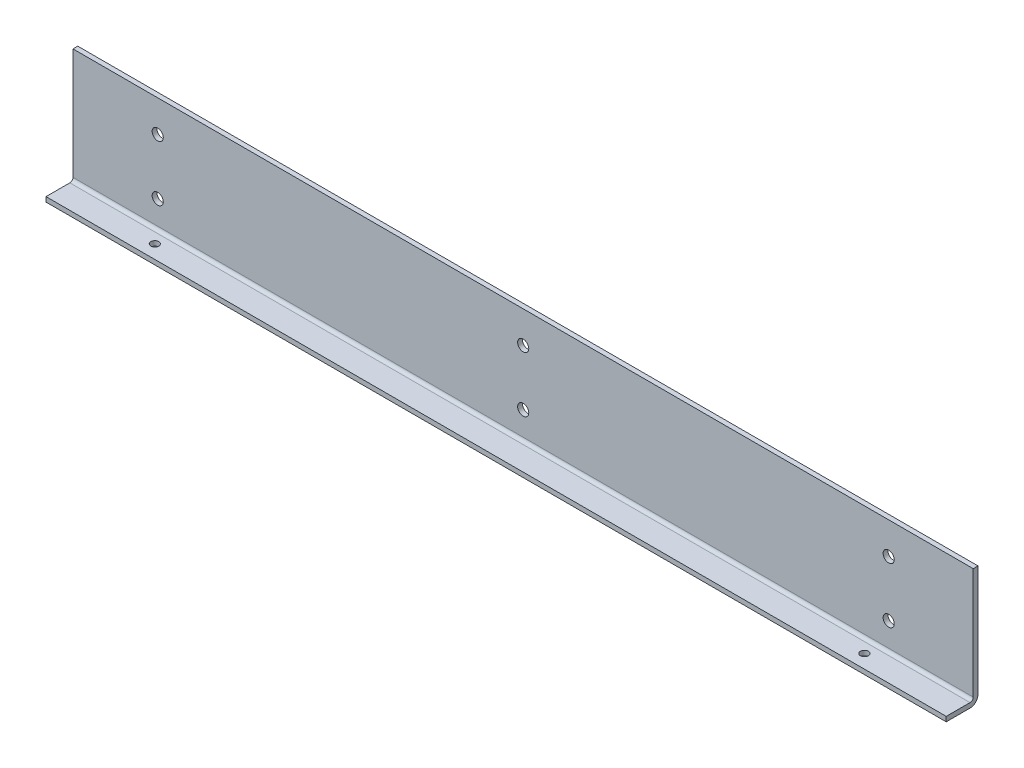
ISO-10303-21;
HEADER;
FILE_DESCRIPTION(('STEP AP214'),'2;1');
FILE_NAME('part.step','',(''),(''),'','','');
FILE_SCHEMA(('AUTOMOTIVE_DESIGN { 1 0 10303 214 1 1 1 1 }'));
ENDSEC;
DATA;
#1=APPLICATION_CONTEXT('core data for automotive mechanical design processes');
#2=APPLICATION_PROTOCOL_DEFINITION('international standard','automotive_design',2000,#1);
#3=PRODUCT_CONTEXT('',#1,'mechanical');
#4=PRODUCT('Part','Part','',(#3));
#5=PRODUCT_RELATED_PRODUCT_CATEGORY('part','',(#4));
#6=PRODUCT_DEFINITION_FORMATION('','',#4);
#7=PRODUCT_DEFINITION_CONTEXT('part definition',#1,'design');
#8=PRODUCT_DEFINITION('design','',#6,#7);
#9=PRODUCT_DEFINITION_SHAPE('','',#8);
#10=(LENGTH_UNIT() NAMED_UNIT(*) SI_UNIT(.MILLI.,.METRE.));
#11=(NAMED_UNIT(*) PLANE_ANGLE_UNIT() SI_UNIT($,.RADIAN.));
#12=(NAMED_UNIT(*) SI_UNIT($,.STERADIAN.) SOLID_ANGLE_UNIT());
#13=UNCERTAINTY_MEASURE_WITH_UNIT(LENGTH_MEASURE(1.E-05),#10,'distance_accuracy_value','');
#14=(GEOMETRIC_REPRESENTATION_CONTEXT(3) GLOBAL_UNCERTAINTY_ASSIGNED_CONTEXT((#13)) GLOBAL_UNIT_ASSIGNED_CONTEXT((#10,
#11,#12)) REPRESENTATION_CONTEXT('',''));
#15=CARTESIAN_POINT('',(0.,0.,0.));
#16=DIRECTION('',(0.,0.,1.));
#17=DIRECTION('',(1.,0.,0.));
#18=AXIS2_PLACEMENT_3D('',#15,#16,#17);
#19=CARTESIAN_POINT('',(0.,0.,3.));
#20=DIRECTION('',(0.,0.,-1.));
#21=DIRECTION('',(-1.,0.,0.));
#22=AXIS2_PLACEMENT_3D('',#19,#20,#21);
#23=PLANE('',#22);
#24=CARTESIAN_POINT('',(513.3,55.,3.));
#25=DIRECTION('',(0.,0.,1.));
#26=DIRECTION('',(1.,0.,0.));
#27=AXIS2_PLACEMENT_3D('',#24,#25,#26);
#28=CIRCLE('',#27,3.49999999999996);
#29=CARTESIAN_POINT('',(516.8,55.,3.));
#30=VERTEX_POINT('',#29);
#31=EDGE_CURVE('E251',#30,#30,#28,.T.);
#32=ORIENTED_EDGE('',*,*,#31,.F.);
#33=EDGE_LOOP('',(#32));
#34=FACE_BOUND('',#33,.T.);
#35=CARTESIAN_POINT('',(283.3,20.,3.));
#36=DIRECTION('',(0.,0.,1.));
#37=DIRECTION('',(1.,0.,0.));
#38=AXIS2_PLACEMENT_3D('',#35,#36,#37);
#39=CIRCLE('',#38,3.50000000000002);
#40=CARTESIAN_POINT('',(286.8,20.,3.));
#41=VERTEX_POINT('',#40);
#42=EDGE_CURVE('E244',#41,#41,#39,.T.);
#43=ORIENTED_EDGE('',*,*,#42,.F.);
#44=EDGE_LOOP('',(#43));
#45=FACE_BOUND('',#44,.T.);
#46=CARTESIAN_POINT('',(283.3,55.,3.));
#47=DIRECTION('',(0.,0.,1.));
#48=DIRECTION('',(1.,0.,0.));
#49=AXIS2_PLACEMENT_3D('',#46,#47,#48);
#50=CIRCLE('',#49,3.50000000000002);
#51=CARTESIAN_POINT('',(286.8,55.,3.));
#52=VERTEX_POINT('',#51);
#53=EDGE_CURVE('E262',#52,#52,#50,.T.);
#54=ORIENTED_EDGE('',*,*,#53,.F.);
#55=EDGE_LOOP('',(#54));
#56=FACE_BOUND('',#55,.T.);
#57=CARTESIAN_POINT('',(53.3,20.,3.));
#58=DIRECTION('',(0.,0.,1.));
#59=DIRECTION('',(1.,0.,0.));
#60=AXIS2_PLACEMENT_3D('',#57,#58,#59);
#61=CIRCLE('',#60,3.5);
#62=CARTESIAN_POINT('',(56.8,20.,3.));
#63=VERTEX_POINT('',#62);
#64=EDGE_CURVE('E256',#63,#63,#61,.T.);
#65=ORIENTED_EDGE('',*,*,#64,.F.);
#66=EDGE_LOOP('',(#65));
#67=FACE_BOUND('',#66,.T.);
#68=CARTESIAN_POINT('',(513.3,20.,3.));
#69=DIRECTION('',(0.,0.,1.));
#70=DIRECTION('',(1.,0.,0.));
#71=AXIS2_PLACEMENT_3D('',#68,#69,#70);
#72=CIRCLE('',#71,3.49999999999996);
#73=CARTESIAN_POINT('',(516.8,20.,3.));
#74=VERTEX_POINT('',#73);
#75=EDGE_CURVE('E237',#74,#74,#72,.T.);
#76=ORIENTED_EDGE('',*,*,#75,.F.);
#77=EDGE_LOOP('',(#76));
#78=FACE_BOUND('',#77,.T.);
#79=CARTESIAN_POINT('',(53.3,55.,3.));
#80=DIRECTION('',(0.,0.,1.));
#81=DIRECTION('',(1.,0.,0.));
#82=AXIS2_PLACEMENT_3D('',#79,#80,#81);
#83=CIRCLE('',#82,3.5);
#84=CARTESIAN_POINT('',(56.8,55.,3.));
#85=VERTEX_POINT('',#84);
#86=EDGE_CURVE('E130',#85,#85,#83,.T.);
#87=ORIENTED_EDGE('',*,*,#86,.F.);
#88=EDGE_LOOP('',(#87));
#89=FACE_BOUND('',#88,.T.);
#90=DIRECTION('',(0.,-1.,0.));
#91=VECTOR('',#90,1.);
#92=CARTESIAN_POINT('',(0.,0.,3.));
#93=LINE('',#92,#91);
#94=CARTESIAN_POINT('',(0.,75.,3.));
#95=VERTEX_POINT('',#94);
#96=CARTESIAN_POINT('',(0.,5.,3.));
#97=VERTEX_POINT('',#96);
#98=EDGE_CURVE('E142',#95,#97,#93,.T.);
#99=ORIENTED_EDGE('',*,*,#98,.T.);
#100=DIRECTION('',(-1.,0.,0.));
#101=VECTOR('',#100,1.);
#102=CARTESIAN_POINT('',(566.5,5.,3.));
#103=LINE('',#102,#101);
#104=CARTESIAN_POINT('',(566.5,5.,3.));
#105=VERTEX_POINT('',#104);
#106=EDGE_CURVE('E163',#97,#105,#103,.F.);
#107=ORIENTED_EDGE('',*,*,#106,.T.);
#108=DIRECTION('',(0.,1.,0.));
#109=VECTOR('',#108,1.);
#110=CARTESIAN_POINT('',(566.5,0.,3.));
#111=LINE('',#110,#109);
#112=CARTESIAN_POINT('',(566.5,75.,3.));
#113=VERTEX_POINT('',#112);
#114=EDGE_CURVE('E145',#105,#113,#111,.T.);
#115=ORIENTED_EDGE('',*,*,#114,.T.);
#116=DIRECTION('',(-1.,0.,0.));
#117=VECTOR('',#116,1.);
#118=CARTESIAN_POINT('',(0.,75.,3.));
#119=LINE('',#118,#117);
#120=EDGE_CURVE('E148',#113,#95,#119,.T.);
#121=ORIENTED_EDGE('',*,*,#120,.T.);
#122=EDGE_LOOP('',(#99,#107,#115,#121));
#123=FACE_BOUND('',#122,.T.);
#124=ADVANCED_FACE('F39',(#34,#45,#56,#67,#78,#89,#123),#23,.F.);
#125=CARTESIAN_POINT('',(0.,0.,3.));
#126=DIRECTION('',(1.,0.,0.));
#127=DIRECTION('',(0.,0.,-1.));
#128=AXIS2_PLACEMENT_3D('',#125,#126,#127);
#129=PLANE('',#128);
#130=DIRECTION('',(0.,-1.,0.));
#131=VECTOR('',#130,1.);
#132=CARTESIAN_POINT('',(0.,0.,0.));
#133=LINE('',#132,#131);
#134=CARTESIAN_POINT('',(0.,75.,0.));
#135=VERTEX_POINT('',#134);
#136=CARTESIAN_POINT('',(0.,5.,0.));
#137=VERTEX_POINT('',#136);
#138=EDGE_CURVE('E141',#135,#137,#133,.T.);
#139=ORIENTED_EDGE('',*,*,#138,.T.);
#140=CARTESIAN_POINT('',(0.,5.,5.));
#141=DIRECTION('',(1.,0.,0.));
#142=DIRECTION('',(0.,0.,-1.));
#143=AXIS2_PLACEMENT_3D('',#140,#141,#142);
#144=CIRCLE('',#143,5.);
#145=CARTESIAN_POINT('',(0.,0.,5.));
#146=VERTEX_POINT('',#145);
#147=EDGE_CURVE('E11',#137,#146,#144,.F.);
#148=ORIENTED_EDGE('',*,*,#147,.T.);
#149=DIRECTION('',(0.,0.,-1.));
#150=VECTOR('',#149,1.);
#151=CARTESIAN_POINT('',(0.,0.,3.));
#152=LINE('',#151,#150);
#153=CARTESIAN_POINT('',(0.,0.,20.));
#154=VERTEX_POINT('',#153);
#155=EDGE_CURVE('E103',#154,#146,#152,.T.);
#156=ORIENTED_EDGE('',*,*,#155,.F.);
#157=DIRECTION('',(0.,-1.,0.));
#158=VECTOR('',#157,1.);
#159=CARTESIAN_POINT('',(0.,0.,20.));
#160=LINE('',#159,#158);
#161=CARTESIAN_POINT('',(0.,3.,20.));
#162=VERTEX_POINT('',#161);
#163=EDGE_CURVE('E108',#162,#154,#160,.T.);
#164=ORIENTED_EDGE('',*,*,#163,.F.);
#165=DIRECTION('',(0.,0.,-1.));
#166=VECTOR('',#165,1.);
#167=CARTESIAN_POINT('',(0.,3.,20.));
#168=LINE('',#167,#166);
#169=CARTESIAN_POINT('',(0.,3.,5.));
#170=VERTEX_POINT('',#169);
#171=EDGE_CURVE('E136',#162,#170,#168,.T.);
#172=ORIENTED_EDGE('',*,*,#171,.T.);
#173=CARTESIAN_POINT('',(0.,5.,5.));
#174=DIRECTION('',(1.,0.,0.));
#175=DIRECTION('',(0.,0.,-1.));
#176=AXIS2_PLACEMENT_3D('',#173,#174,#175);
#177=CIRCLE('',#176,2.);
#178=EDGE_CURVE('E165',#170,#97,#177,.T.);
#179=ORIENTED_EDGE('',*,*,#178,.T.);
#180=ORIENTED_EDGE('',*,*,#98,.F.);
#181=DIRECTION('',(0.,0.,-1.));
#182=VECTOR('',#181,1.);
#183=CARTESIAN_POINT('',(0.,75.,3.));
#184=LINE('',#183,#182);
#185=EDGE_CURVE('E150',#95,#135,#184,.T.);
#186=ORIENTED_EDGE('',*,*,#185,.T.);
#187=EDGE_LOOP('',(#139,#148,#156,#164,#172,#179,#180,#186));
#188=FACE_BOUND('',#187,.T.);
#189=ADVANCED_FACE('F105',(#188),#129,.F.);
#190=CARTESIAN_POINT('',(0.,0.,3.));
#191=DIRECTION('',(0.,1.,0.));
#192=DIRECTION('',(0.,0.,1.));
#193=AXIS2_PLACEMENT_3D('',#190,#191,#192);
#194=PLANE('',#193);
#195=CARTESIAN_POINT('',(60.,0.,11.5));
#196=DIRECTION('',(0.,1.,0.));
#197=DIRECTION('',(0.,0.,1.));
#198=AXIS2_PLACEMENT_3D('',#195,#196,#197);
#199=CIRCLE('',#198,2.49999999999999);
#200=CARTESIAN_POINT('',(60.,0.,14.));
#201=VERTEX_POINT('',#200);
#202=EDGE_CURVE('E225',#201,#201,#199,.T.);
#203=ORIENTED_EDGE('',*,*,#202,.T.);
#204=EDGE_LOOP('',(#203));
#205=FACE_BOUND('',#204,.T.);
#206=CARTESIAN_POINT('',(506.5,0.,11.5));
#207=DIRECTION('',(0.,1.,0.));
#208=DIRECTION('',(0.,0.,1.));
#209=AXIS2_PLACEMENT_3D('',#206,#207,#208);
#210=CIRCLE('',#209,2.50000000000003);
#211=CARTESIAN_POINT('',(506.5,0.,14.));
#212=VERTEX_POINT('',#211);
#213=EDGE_CURVE('E228',#212,#212,#210,.T.);
#214=ORIENTED_EDGE('',*,*,#213,.T.);
#215=EDGE_LOOP('',(#214));
#216=FACE_BOUND('',#215,.T.);
#217=ORIENTED_EDGE('',*,*,#155,.T.);
#218=DIRECTION('',(1.,0.,0.));
#219=VECTOR('',#218,1.);
#220=CARTESIAN_POINT('',(566.5,0.,5.));
#221=LINE('',#220,#219);
#222=CARTESIAN_POINT('',(566.5,0.,5.));
#223=VERTEX_POINT('',#222);
#224=EDGE_CURVE('E169',#146,#223,#221,.T.);
#225=ORIENTED_EDGE('',*,*,#224,.T.);
#226=DIRECTION('',(0.,0.,-1.));
#227=VECTOR('',#226,1.);
#228=CARTESIAN_POINT('',(566.5,0.,3.));
#229=LINE('',#228,#227);
#230=CARTESIAN_POINT('',(566.5,0.,20.));
#231=VERTEX_POINT('',#230);
#232=EDGE_CURVE('E114',#231,#223,#229,.T.);
#233=ORIENTED_EDGE('',*,*,#232,.F.);
#234=DIRECTION('',(1.,0.,0.));
#235=VECTOR('',#234,1.);
#236=CARTESIAN_POINT('',(0.,0.,20.));
#237=LINE('',#236,#235);
#238=EDGE_CURVE('E117',#154,#231,#237,.T.);
#239=ORIENTED_EDGE('',*,*,#238,.F.);
#240=EDGE_LOOP('',(#217,#225,#233,#239));
#241=FACE_BOUND('',#240,.T.);
#242=ADVANCED_FACE('F118',(#205,#216,#241),#194,.F.);
#243=CARTESIAN_POINT('',(566.5,0.,3.));
#244=DIRECTION('',(-1.,0.,0.));
#245=DIRECTION('',(0.,0.,1.));
#246=AXIS2_PLACEMENT_3D('',#243,#244,#245);
#247=PLANE('',#246);
#248=ORIENTED_EDGE('',*,*,#232,.T.);
#249=CARTESIAN_POINT('',(566.5,5.,5.));
#250=DIRECTION('',(-1.,0.,0.));
#251=DIRECTION('',(0.,0.,1.));
#252=AXIS2_PLACEMENT_3D('',#249,#250,#251);
#253=CIRCLE('',#252,5.);
#254=CARTESIAN_POINT('',(566.5,5.,0.));
#255=VERTEX_POINT('',#254);
#256=EDGE_CURVE('E61',#223,#255,#253,.F.);
#257=ORIENTED_EDGE('',*,*,#256,.T.);
#258=DIRECTION('',(0.,1.,0.));
#259=VECTOR('',#258,1.);
#260=CARTESIAN_POINT('',(566.5,0.,0.));
#261=LINE('',#260,#259);
#262=CARTESIAN_POINT('',(566.5,75.,0.));
#263=VERTEX_POINT('',#262);
#264=EDGE_CURVE('E152',#255,#263,#261,.T.);
#265=ORIENTED_EDGE('',*,*,#264,.T.);
#266=DIRECTION('',(0.,0.,-1.));
#267=VECTOR('',#266,1.);
#268=CARTESIAN_POINT('',(566.5,75.,3.));
#269=LINE('',#268,#267);
#270=EDGE_CURVE('E157',#113,#263,#269,.T.);
#271=ORIENTED_EDGE('',*,*,#270,.F.);
#272=ORIENTED_EDGE('',*,*,#114,.F.);
#273=CARTESIAN_POINT('',(566.5,5.,5.));
#274=DIRECTION('',(-1.,0.,0.));
#275=DIRECTION('',(0.,0.,1.));
#276=AXIS2_PLACEMENT_3D('',#273,#274,#275);
#277=CIRCLE('',#276,2.);
#278=CARTESIAN_POINT('',(566.5,3.,5.));
#279=VERTEX_POINT('',#278);
#280=EDGE_CURVE('E167',#105,#279,#277,.T.);
#281=ORIENTED_EDGE('',*,*,#280,.T.);
#282=DIRECTION('',(0.,0.,-1.));
#283=VECTOR('',#282,1.);
#284=CARTESIAN_POINT('',(566.5,3.,20.));
#285=LINE('',#284,#283);
#286=CARTESIAN_POINT('',(566.5,3.,20.));
#287=VERTEX_POINT('',#286);
#288=EDGE_CURVE('E138',#287,#279,#285,.T.);
#289=ORIENTED_EDGE('',*,*,#288,.F.);
#290=DIRECTION('',(0.,1.,0.));
#291=VECTOR('',#290,1.);
#292=CARTESIAN_POINT('',(566.5,0.,20.));
#293=LINE('',#292,#291);
#294=EDGE_CURVE('E121',#231,#287,#293,.T.);
#295=ORIENTED_EDGE('',*,*,#294,.F.);
#296=EDGE_LOOP('',(#248,#257,#265,#271,#272,#281,#289,#295));
#297=FACE_BOUND('',#296,.T.);
#298=ADVANCED_FACE('F172',(#297),#247,.F.);
#299=CARTESIAN_POINT('',(0.,75.,3.));
#300=DIRECTION('',(0.,-1.,0.));
#301=DIRECTION('',(0.,0.,-1.));
#302=AXIS2_PLACEMENT_3D('',#299,#300,#301);
#303=PLANE('',#302);
#304=DIRECTION('',(-1.,0.,0.));
#305=VECTOR('',#304,1.);
#306=CARTESIAN_POINT('',(0.,75.,0.));
#307=LINE('',#306,#305);
#308=EDGE_CURVE('E146',#263,#135,#307,.T.);
#309=ORIENTED_EDGE('',*,*,#308,.T.);
#310=ORIENTED_EDGE('',*,*,#185,.F.);
#311=ORIENTED_EDGE('',*,*,#120,.F.);
#312=ORIENTED_EDGE('',*,*,#270,.T.);
#313=EDGE_LOOP('',(#309,#310,#311,#312));
#314=FACE_BOUND('',#313,.T.);
#315=ADVANCED_FACE('F211',(#314),#303,.F.);
#316=CARTESIAN_POINT('',(0.,0.,0.));
#317=DIRECTION('',(0.,0.,-1.));
#318=DIRECTION('',(-1.,0.,0.));
#319=AXIS2_PLACEMENT_3D('',#316,#317,#318);
#320=PLANE('',#319);
#321=CARTESIAN_POINT('',(513.3,55.,0.));
#322=DIRECTION('',(0.,0.,1.));
#323=DIRECTION('',(1.,0.,0.));
#324=AXIS2_PLACEMENT_3D('',#321,#322,#323);
#325=CIRCLE('',#324,3.49999999999996);
#326=CARTESIAN_POINT('',(516.8,55.,0.));
#327=VERTEX_POINT('',#326);
#328=EDGE_CURVE('E240',#327,#327,#325,.T.);
#329=ORIENTED_EDGE('',*,*,#328,.T.);
#330=EDGE_LOOP('',(#329));
#331=FACE_BOUND('',#330,.T.);
#332=CARTESIAN_POINT('',(283.3,20.,0.));
#333=DIRECTION('',(0.,0.,1.));
#334=DIRECTION('',(1.,0.,0.));
#335=AXIS2_PLACEMENT_3D('',#332,#333,#334);
#336=CIRCLE('',#335,3.50000000000002);
#337=CARTESIAN_POINT('',(286.8,20.,0.));
#338=VERTEX_POINT('',#337);
#339=EDGE_CURVE('E248',#338,#338,#336,.T.);
#340=ORIENTED_EDGE('',*,*,#339,.T.);
#341=EDGE_LOOP('',(#340));
#342=FACE_BOUND('',#341,.T.);
#343=CARTESIAN_POINT('',(283.3,55.,0.));
#344=DIRECTION('',(0.,0.,1.));
#345=DIRECTION('',(1.,0.,0.));
#346=AXIS2_PLACEMENT_3D('',#343,#344,#345);
#347=CIRCLE('',#346,3.50000000000002);
#348=CARTESIAN_POINT('',(286.8,55.,0.));
#349=VERTEX_POINT('',#348);
#350=EDGE_CURVE('E247',#349,#349,#347,.T.);
#351=ORIENTED_EDGE('',*,*,#350,.T.);
#352=EDGE_LOOP('',(#351));
#353=FACE_BOUND('',#352,.T.);
#354=CARTESIAN_POINT('',(53.3,20.,0.));
#355=DIRECTION('',(0.,0.,1.));
#356=DIRECTION('',(1.,0.,0.));
#357=AXIS2_PLACEMENT_3D('',#354,#355,#356);
#358=CIRCLE('',#357,3.5);
#359=CARTESIAN_POINT('',(56.8,20.,0.));
#360=VERTEX_POINT('',#359);
#361=EDGE_CURVE('E259',#360,#360,#358,.T.);
#362=ORIENTED_EDGE('',*,*,#361,.T.);
#363=EDGE_LOOP('',(#362));
#364=FACE_BOUND('',#363,.T.);
#365=CARTESIAN_POINT('',(513.3,20.,0.));
#366=DIRECTION('',(0.,0.,1.));
#367=DIRECTION('',(1.,0.,0.));
#368=AXIS2_PLACEMENT_3D('',#365,#366,#367);
#369=CIRCLE('',#368,3.49999999999996);
#370=CARTESIAN_POINT('',(516.8,20.,0.));
#371=VERTEX_POINT('',#370);
#372=EDGE_CURVE('E241',#371,#371,#369,.T.);
#373=ORIENTED_EDGE('',*,*,#372,.T.);
#374=EDGE_LOOP('',(#373));
#375=FACE_BOUND('',#374,.T.);
#376=CARTESIAN_POINT('',(53.3,55.,0.));
#377=DIRECTION('',(0.,0.,1.));
#378=DIRECTION('',(1.,0.,0.));
#379=AXIS2_PLACEMENT_3D('',#376,#377,#378);
#380=CIRCLE('',#379,3.5);
#381=CARTESIAN_POINT('',(56.8,55.,0.));
#382=VERTEX_POINT('',#381);
#383=EDGE_CURVE('E127',#382,#382,#380,.T.);
#384=ORIENTED_EDGE('',*,*,#383,.T.);
#385=EDGE_LOOP('',(#384));
#386=FACE_BOUND('',#385,.T.);
#387=ORIENTED_EDGE('',*,*,#264,.F.);
#388=DIRECTION('',(1.,0.,0.));
#389=VECTOR('',#388,1.);
#390=CARTESIAN_POINT('',(0.,5.,0.));
#391=LINE('',#390,#389);
#392=EDGE_CURVE('E47',#255,#137,#391,.F.);
#393=ORIENTED_EDGE('',*,*,#392,.T.);
#394=ORIENTED_EDGE('',*,*,#138,.F.);
#395=ORIENTED_EDGE('',*,*,#308,.F.);
#396=EDGE_LOOP('',(#387,#393,#394,#395));
#397=FACE_BOUND('',#396,.T.);
#398=ADVANCED_FACE('F208',(#331,#342,#353,#364,#375,#386,#397),#320,.T.);
#399=CARTESIAN_POINT('',(0.,3.,20.));
#400=DIRECTION('',(0.,-1.,0.));
#401=DIRECTION('',(0.,0.,-1.));
#402=AXIS2_PLACEMENT_3D('',#399,#400,#401);
#403=PLANE('',#402);
#404=CARTESIAN_POINT('',(60.,3.,11.5));
#405=DIRECTION('',(0.,1.,0.));
#406=DIRECTION('',(0.,0.,1.));
#407=AXIS2_PLACEMENT_3D('',#404,#405,#406);
#408=CIRCLE('',#407,2.49999999999999);
#409=CARTESIAN_POINT('',(60.,3.,14.));
#410=VERTEX_POINT('',#409);
#411=EDGE_CURVE('E233',#410,#410,#408,.T.);
#412=ORIENTED_EDGE('',*,*,#411,.F.);
#413=EDGE_LOOP('',(#412));
#414=FACE_BOUND('',#413,.T.);
#415=CARTESIAN_POINT('',(506.5,3.,11.5));
#416=DIRECTION('',(0.,1.,0.));
#417=DIRECTION('',(0.,0.,1.));
#418=AXIS2_PLACEMENT_3D('',#415,#416,#417);
#419=CIRCLE('',#418,2.50000000000003);
#420=CARTESIAN_POINT('',(506.5,3.,14.));
#421=VERTEX_POINT('',#420);
#422=EDGE_CURVE('E230',#421,#421,#419,.T.);
#423=ORIENTED_EDGE('',*,*,#422,.F.);
#424=EDGE_LOOP('',(#423));
#425=FACE_BOUND('',#424,.T.);
#426=ORIENTED_EDGE('',*,*,#288,.T.);
#427=DIRECTION('',(-1.,0.,0.));
#428=VECTOR('',#427,1.);
#429=CARTESIAN_POINT('',(0.,3.,5.));
#430=LINE('',#429,#428);
#431=EDGE_CURVE('E113',#279,#170,#430,.T.);
#432=ORIENTED_EDGE('',*,*,#431,.T.);
#433=ORIENTED_EDGE('',*,*,#171,.F.);
#434=DIRECTION('',(-1.,0.,0.));
#435=VECTOR('',#434,1.);
#436=CARTESIAN_POINT('',(0.,3.,20.));
#437=LINE('',#436,#435);
#438=EDGE_CURVE('E125',#287,#162,#437,.T.);
#439=ORIENTED_EDGE('',*,*,#438,.F.);
#440=EDGE_LOOP('',(#426,#432,#433,#439));
#441=FACE_BOUND('',#440,.T.);
#442=ADVANCED_FACE('F178',(#414,#425,#441),#403,.F.);
#443=CARTESIAN_POINT('',(0.,0.,20.));
#444=DIRECTION('',(0.,0.,-1.));
#445=DIRECTION('',(-1.,0.,0.));
#446=AXIS2_PLACEMENT_3D('',#443,#444,#445);
#447=PLANE('',#446);
#448=ORIENTED_EDGE('',*,*,#163,.T.);
#449=ORIENTED_EDGE('',*,*,#238,.T.);
#450=ORIENTED_EDGE('',*,*,#294,.T.);
#451=ORIENTED_EDGE('',*,*,#438,.T.);
#452=EDGE_LOOP('',(#448,#449,#450,#451));
#453=FACE_BOUND('',#452,.T.);
#454=ADVANCED_FACE('F123',(#453),#447,.F.);
#455=CARTESIAN_POINT('',(53.3,55.,0.));
#456=DIRECTION('',(0.,0.,1.));
#457=DIRECTION('',(1.,0.,0.));
#458=AXIS2_PLACEMENT_3D('',#455,#456,#457);
#459=CYLINDRICAL_SURFACE('',#458,3.5);
#460=ORIENTED_EDGE('',*,*,#383,.F.);
#461=EDGE_LOOP('',(#460));
#462=FACE_BOUND('',#461,.T.);
#463=ORIENTED_EDGE('',*,*,#86,.T.);
#464=EDGE_LOOP('',(#463));
#465=FACE_BOUND('',#464,.T.);
#466=ADVANCED_FACE('F286',(#462,#465),#459,.F.);
#467=CARTESIAN_POINT('',(513.3,20.,0.));
#468=DIRECTION('',(0.,0.,1.));
#469=DIRECTION('',(1.,0.,0.));
#470=AXIS2_PLACEMENT_3D('',#467,#468,#469);
#471=CYLINDRICAL_SURFACE('',#470,3.49999999999996);
#472=ORIENTED_EDGE('',*,*,#372,.F.);
#473=EDGE_LOOP('',(#472));
#474=FACE_BOUND('',#473,.T.);
#475=ORIENTED_EDGE('',*,*,#75,.T.);
#476=EDGE_LOOP('',(#475));
#477=FACE_BOUND('',#476,.T.);
#478=ADVANCED_FACE('F288',(#474,#477),#471,.F.);
#479=CARTESIAN_POINT('',(53.3,20.,0.));
#480=DIRECTION('',(0.,0.,1.));
#481=DIRECTION('',(1.,0.,0.));
#482=AXIS2_PLACEMENT_3D('',#479,#480,#481);
#483=CYLINDRICAL_SURFACE('',#482,3.5);
#484=ORIENTED_EDGE('',*,*,#361,.F.);
#485=EDGE_LOOP('',(#484));
#486=FACE_BOUND('',#485,.T.);
#487=ORIENTED_EDGE('',*,*,#64,.T.);
#488=EDGE_LOOP('',(#487));
#489=FACE_BOUND('',#488,.T.);
#490=ADVANCED_FACE('F274',(#486,#489),#483,.F.);
#491=CARTESIAN_POINT('',(283.3,55.,0.));
#492=DIRECTION('',(0.,0.,1.));
#493=DIRECTION('',(1.,0.,0.));
#494=AXIS2_PLACEMENT_3D('',#491,#492,#493);
#495=CYLINDRICAL_SURFACE('',#494,3.50000000000002);
#496=ORIENTED_EDGE('',*,*,#350,.F.);
#497=EDGE_LOOP('',(#496));
#498=FACE_BOUND('',#497,.T.);
#499=ORIENTED_EDGE('',*,*,#53,.T.);
#500=EDGE_LOOP('',(#499));
#501=FACE_BOUND('',#500,.T.);
#502=ADVANCED_FACE('F270',(#498,#501),#495,.F.);
#503=CARTESIAN_POINT('',(283.3,20.,0.));
#504=DIRECTION('',(0.,0.,1.));
#505=DIRECTION('',(1.,0.,0.));
#506=AXIS2_PLACEMENT_3D('',#503,#504,#505);
#507=CYLINDRICAL_SURFACE('',#506,3.50000000000002);
#508=ORIENTED_EDGE('',*,*,#339,.F.);
#509=EDGE_LOOP('',(#508));
#510=FACE_BOUND('',#509,.T.);
#511=ORIENTED_EDGE('',*,*,#42,.T.);
#512=EDGE_LOOP('',(#511));
#513=FACE_BOUND('',#512,.T.);
#514=ADVANCED_FACE('F273',(#510,#513),#507,.F.);
#515=CARTESIAN_POINT('',(513.3,55.,0.));
#516=DIRECTION('',(0.,0.,1.));
#517=DIRECTION('',(1.,0.,0.));
#518=AXIS2_PLACEMENT_3D('',#515,#516,#517);
#519=CYLINDRICAL_SURFACE('',#518,3.49999999999996);
#520=ORIENTED_EDGE('',*,*,#328,.F.);
#521=EDGE_LOOP('',(#520));
#522=FACE_BOUND('',#521,.T.);
#523=ORIENTED_EDGE('',*,*,#31,.T.);
#524=EDGE_LOOP('',(#523));
#525=FACE_BOUND('',#524,.T.);
#526=ADVANCED_FACE('F302',(#522,#525),#519,.F.);
#527=CARTESIAN_POINT('',(506.5,0.,11.5));
#528=DIRECTION('',(0.,1.,0.));
#529=DIRECTION('',(0.,0.,1.));
#530=AXIS2_PLACEMENT_3D('',#527,#528,#529);
#531=CYLINDRICAL_SURFACE('',#530,2.50000000000003);
#532=ORIENTED_EDGE('',*,*,#213,.F.);
#533=EDGE_LOOP('',(#532));
#534=FACE_BOUND('',#533,.T.);
#535=ORIENTED_EDGE('',*,*,#422,.T.);
#536=EDGE_LOOP('',(#535));
#537=FACE_BOUND('',#536,.T.);
#538=ADVANCED_FACE('F194',(#534,#537),#531,.F.);
#539=CARTESIAN_POINT('',(60.,0.,11.5));
#540=DIRECTION('',(0.,1.,0.));
#541=DIRECTION('',(0.,0.,1.));
#542=AXIS2_PLACEMENT_3D('',#539,#540,#541);
#543=CYLINDRICAL_SURFACE('',#542,2.49999999999999);
#544=ORIENTED_EDGE('',*,*,#202,.F.);
#545=EDGE_LOOP('',(#544));
#546=FACE_BOUND('',#545,.T.);
#547=ORIENTED_EDGE('',*,*,#411,.T.);
#548=EDGE_LOOP('',(#547));
#549=FACE_BOUND('',#548,.T.);
#550=ADVANCED_FACE('F187',(#546,#549),#543,.F.);
#551=CARTESIAN_POINT('',(0.,5.,5.));
#552=DIRECTION('',(1.,0.,0.));
#553=DIRECTION('',(0.,0.,-1.));
#554=AXIS2_PLACEMENT_3D('',#551,#552,#553);
#555=CYLINDRICAL_SURFACE('',#554,2.);
#556=ORIENTED_EDGE('',*,*,#280,.F.);
#557=ORIENTED_EDGE('',*,*,#106,.F.);
#558=ORIENTED_EDGE('',*,*,#178,.F.);
#559=ORIENTED_EDGE('',*,*,#431,.F.);
#560=EDGE_LOOP('',(#556,#557,#558,#559));
#561=FACE_BOUND('',#560,.T.);
#562=ADVANCED_FACE('F185',(#561),#555,.F.);
#563=CARTESIAN_POINT('',(0.,5.,5.));
#564=DIRECTION('',(-1.,0.,0.));
#565=DIRECTION('',(0.,0.,1.));
#566=AXIS2_PLACEMENT_3D('',#563,#564,#565);
#567=CYLINDRICAL_SURFACE('',#566,5.);
#568=ORIENTED_EDGE('',*,*,#147,.F.);
#569=ORIENTED_EDGE('',*,*,#392,.F.);
#570=ORIENTED_EDGE('',*,*,#256,.F.);
#571=ORIENTED_EDGE('',*,*,#224,.F.);
#572=EDGE_LOOP('',(#568,#569,#570,#571));
#573=FACE_BOUND('',#572,.T.);
#574=ADVANCED_FACE('F41',(#573),#567,.T.);
#575=CLOSED_SHELL('',(#124,#189,#242,#298,#315,#398,#442,#454,#466,#478,#490,#502,#514,#526,
#538,#550,#562,#574));
#576=MANIFOLD_SOLID_BREP('B2',#575);
#577=ADVANCED_BREP_SHAPE_REPRESENTATION('',(#18,#576),#14);
#578=SHAPE_DEFINITION_REPRESENTATION(#9,#577);
ENDSEC;
END-ISO-10303-21;
